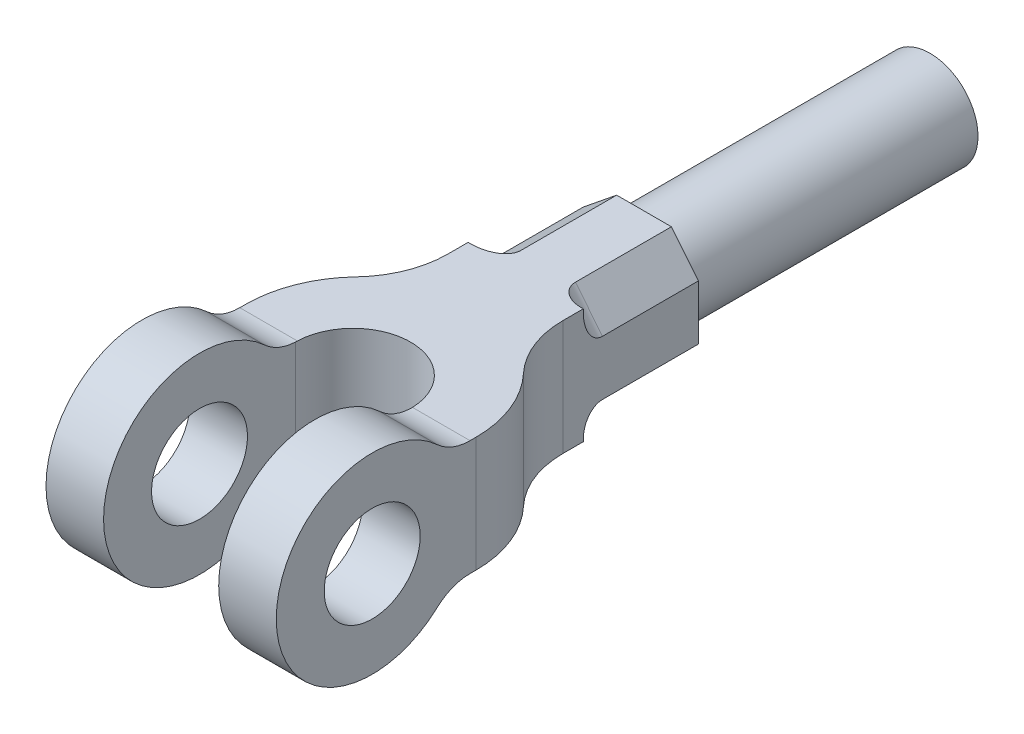
ISO-10303-21;
HEADER;
FILE_DESCRIPTION(('STEP AP214'),'2;1');
FILE_NAME('part.step','',(''),(''),'','','');
FILE_SCHEMA(('AUTOMOTIVE_DESIGN { 1 0 10303 214 1 1 1 1 }'));
ENDSEC;
DATA;
#1=APPLICATION_CONTEXT('core data for automotive mechanical design processes');
#2=APPLICATION_PROTOCOL_DEFINITION('international standard','automotive_design',2000,#1);
#3=PRODUCT_CONTEXT('',#1,'mechanical');
#4=PRODUCT('Part','Part','',(#3));
#5=PRODUCT_RELATED_PRODUCT_CATEGORY('part','',(#4));
#6=PRODUCT_DEFINITION_FORMATION('','',#4);
#7=PRODUCT_DEFINITION_CONTEXT('part definition',#1,'design');
#8=PRODUCT_DEFINITION('design','',#6,#7);
#9=PRODUCT_DEFINITION_SHAPE('','',#8);
#10=(LENGTH_UNIT() NAMED_UNIT(*) SI_UNIT(.MILLI.,.METRE.));
#11=(NAMED_UNIT(*) PLANE_ANGLE_UNIT() SI_UNIT($,.RADIAN.));
#12=(NAMED_UNIT(*) SI_UNIT($,.STERADIAN.) SOLID_ANGLE_UNIT());
#13=UNCERTAINTY_MEASURE_WITH_UNIT(LENGTH_MEASURE(1.E-05),#10,'distance_accuracy_value','');
#14=(GEOMETRIC_REPRESENTATION_CONTEXT(3) GLOBAL_UNCERTAINTY_ASSIGNED_CONTEXT((#13)) GLOBAL_UNIT_ASSIGNED_CONTEXT((#10,
#11,#12)) REPRESENTATION_CONTEXT('',''));
#15=CARTESIAN_POINT('',(0.,0.,0.));
#16=DIRECTION('',(0.,0.,1.));
#17=DIRECTION('',(1.,0.,0.));
#18=AXIS2_PLACEMENT_3D('',#15,#16,#17);
#19=CARTESIAN_POINT('',(-600.,1000.,-1250.));
#20=DIRECTION('',(0.,0.,1.));
#21=DIRECTION('',(1.,0.,0.));
#22=AXIS2_PLACEMENT_3D('',#19,#20,#21);
#23=PLANE('',#22);
#24=CARTESIAN_POINT('',(-4.44089209850063E-12,499.999999999998,-1250.));
#25=DIRECTION('',(0.,0.,1.));
#26=DIRECTION('',(1.,0.,0.));
#27=AXIS2_PLACEMENT_3D('',#24,#25,#26);
#28=CIRCLE('',#27,250.);
#29=CARTESIAN_POINT('',(249.999999999996,499.999999999998,-1250.));
#30=VERTEX_POINT('',#29);
#31=EDGE_CURVE('E501',#30,#30,#28,.F.);
#32=ORIENTED_EDGE('',*,*,#31,.F.);
#33=EDGE_LOOP('',(#32));
#34=FACE_BOUND('',#33,.T.);
#35=DIRECTION('',(0.77764026412455,0.628709487452114,0.));
#36=VECTOR('',#35,1.);
#37=CARTESIAN_POINT('',(-440.932577575048,545.382140607024,-1250.));
#38=LINE('',#37,#36);
#39=CARTESIAN_POINT('',(-300.,659.323834086931,-1250.));
#40=VERTEX_POINT('',#39);
#41=CARTESIAN_POINT('',(-126.,800.,-1250.));
#42=VERTEX_POINT('',#41);
#43=EDGE_CURVE('E341',#40,#42,#38,.T.);
#44=ORIENTED_EDGE('',*,*,#43,.T.);
#45=DIRECTION('',(1.,0.,0.));
#46=VECTOR('',#45,1.);
#47=CARTESIAN_POINT('',(-600.,800.,-1250.));
#48=LINE('',#47,#46);
#49=CARTESIAN_POINT('',(159.323834086921,800.,-1250.));
#50=VERTEX_POINT('',#49);
#51=EDGE_CURVE('E588',#42,#50,#48,.T.);
#52=ORIENTED_EDGE('',*,*,#51,.T.);
#53=DIRECTION('',(0.628709487452122,-0.777640264124543,0.));
#54=VECTOR('',#53,1.);
#55=CARTESIAN_POINT('',(487.474856353104,394.115481441266,-1250.));
#56=LINE('',#55,#54);
#57=CARTESIAN_POINT('',(300.,625.999999999997,-1250.));
#58=VERTEX_POINT('',#57);
#59=EDGE_CURVE('E625',#50,#58,#56,.T.);
#60=ORIENTED_EDGE('',*,*,#59,.T.);
#61=DIRECTION('',(0.,1.,0.));
#62=VECTOR('',#61,1.);
#63=CARTESIAN_POINT('',(300.,0.,-1250.));
#64=LINE('',#63,#62);
#65=CARTESIAN_POINT('',(300.,340.676165913073,-1250.));
#66=VERTEX_POINT('',#65);
#67=EDGE_CURVE('E388',#66,#58,#64,.T.);
#68=ORIENTED_EDGE('',*,*,#67,.F.);
#69=DIRECTION('',(-0.777640264124545,-0.62870948745212,0.));
#70=VECTOR('',#69,1.);
#71=CARTESIAN_POINT('',(-47.9772343048254,59.3422397806761,-1250.));
#72=LINE('',#71,#70);
#73=CARTESIAN_POINT('',(125.999999999993,200.,-1250.));
#74=VERTEX_POINT('',#73);
#75=EDGE_CURVE('E639',#66,#74,#72,.T.);
#76=ORIENTED_EDGE('',*,*,#75,.T.);
#77=DIRECTION('',(1.,0.,0.));
#78=VECTOR('',#77,1.);
#79=CARTESIAN_POINT('',(-600.,200.,-1250.));
#80=LINE('',#79,#78);
#81=CARTESIAN_POINT('',(-159.323834086935,200.,-1250.));
#82=VERTEX_POINT('',#81);
#83=EDGE_CURVE('E608',#82,#74,#80,.T.);
#84=ORIENTED_EDGE('',*,*,#83,.F.);
#85=DIRECTION('',(-0.628709487452117,0.777640264124548,0.));
#86=VECTOR('',#85,1.);
#87=CARTESIAN_POINT('',(1.43495552676098,1.16013817103738,-1250.));
#88=LINE('',#87,#86);
#89=CARTESIAN_POINT('',(-300.,374.000000000002,-1250.));
#90=VERTEX_POINT('',#89);
#91=EDGE_CURVE('E638',#82,#90,#88,.T.);
#92=ORIENTED_EDGE('',*,*,#91,.T.);
#93=DIRECTION('',(0.,1.,0.));
#94=VECTOR('',#93,1.);
#95=CARTESIAN_POINT('',(-300.,0.,-1250.));
#96=LINE('',#95,#94);
#97=EDGE_CURVE('E397',#90,#40,#96,.T.);
#98=ORIENTED_EDGE('',*,*,#97,.T.);
#99=EDGE_LOOP('',(#44,#52,#60,#68,#76,#84,#92,#98));
#100=FACE_BOUND('',#99,.T.);
#101=ADVANCED_FACE('F137',(#34,#100),#23,.F.);
#102=CARTESIAN_POINT('',(300.,0.,0.));
#103=DIRECTION('',(-1.,0.,0.));
#104=DIRECTION('',(0.,0.,1.));
#105=AXIS2_PLACEMENT_3D('',#102,#103,#104);
#106=PLANE('',#105);
#107=DIRECTION('',(0.,-1.,0.));
#108=VECTOR('',#107,1.);
#109=CARTESIAN_POINT('',(300.,0.,-650.));
#110=LINE('',#109,#108);
#111=CARTESIAN_POINT('',(300.,212.082001473069,-650.));
#112=VERTEX_POINT('',#111);
#113=CARTESIAN_POINT('',(300.,200.,-650.));
#114=VERTEX_POINT('',#113);
#115=EDGE_CURVE('E642',#112,#114,#110,.T.);
#116=ORIENTED_EDGE('',*,*,#115,.F.);
#117=CARTESIAN_POINT('',(300.,212.082001473069,-750.));
#118=DIRECTION('',(-1.,0.,0.));
#119=DIRECTION('',(0.,1.,0.));
#120=AXIS2_PLACEMENT_3D('',#117,#118,#119);
#121=ELLIPSE('',#120,128.594164440004,100.);
#122=CARTESIAN_POINT('',(300.,340.676165913073,-750.));
#123=VERTEX_POINT('',#122);
#124=EDGE_CURVE('E699',#112,#123,#121,.T.);
#125=ORIENTED_EDGE('',*,*,#124,.T.);
#126=DIRECTION('',(0.,0.,-1.));
#127=VECTOR('',#126,1.);
#128=CARTESIAN_POINT('',(300.,340.676165913073,-650.));
#129=LINE('',#128,#127);
#130=EDGE_CURVE('E633',#123,#66,#129,.T.);
#131=ORIENTED_EDGE('',*,*,#130,.T.);
#132=ORIENTED_EDGE('',*,*,#67,.T.);
#133=DIRECTION('',(0.,0.,-1.));
#134=VECTOR('',#133,1.);
#135=CARTESIAN_POINT('',(300.,625.999999999997,-650.));
#136=LINE('',#135,#134);
#137=CARTESIAN_POINT('',(300.,625.999999999997,-750.));
#138=VERTEX_POINT('',#137);
#139=EDGE_CURVE('E618',#138,#58,#136,.T.);
#140=ORIENTED_EDGE('',*,*,#139,.F.);
#141=CARTESIAN_POINT('',(300.,785.05597417537,-750.));
#142=DIRECTION('',(-1.,0.,0.));
#143=DIRECTION('',(0.,1.,0.));
#144=AXIS2_PLACEMENT_3D('',#141,#142,#143);
#145=ELLIPSE('',#144,159.055974175378,100.);
#146=CARTESIAN_POINT('',(300.,785.055974175371,-650.));
#147=VERTEX_POINT('',#146);
#148=EDGE_CURVE('E693',#138,#147,#145,.T.);
#149=ORIENTED_EDGE('',*,*,#148,.T.);
#150=DIRECTION('',(0.,-1.,0.));
#151=VECTOR('',#150,1.);
#152=CARTESIAN_POINT('',(300.,0.,-650.));
#153=LINE('',#152,#151);
#154=CARTESIAN_POINT('',(300.,800.,-650.));
#155=VERTEX_POINT('',#154);
#156=EDGE_CURVE('E623',#155,#147,#153,.T.);
#157=ORIENTED_EDGE('',*,*,#156,.F.);
#158=DIRECTION('',(0.,0.,-1.));
#159=VECTOR('',#158,1.);
#160=CARTESIAN_POINT('',(300.,800.,-1.58264725967266E-13));
#161=LINE('',#160,#159);
#162=CARTESIAN_POINT('',(300.,800.,-544.983443527075));
#163=VERTEX_POINT('',#162);
#164=EDGE_CURVE('E403',#163,#155,#161,.T.);
#165=ORIENTED_EDGE('',*,*,#164,.F.);
#166=DIRECTION('',(0.,1.,0.));
#167=VECTOR('',#166,1.);
#168=CARTESIAN_POINT('',(300.,0.,-544.983443527075));
#169=LINE('',#168,#167);
#170=CARTESIAN_POINT('',(300.,200.,-544.983443527075));
#171=VERTEX_POINT('',#170);
#172=EDGE_CURVE('E386',#171,#163,#169,.T.);
#173=ORIENTED_EDGE('',*,*,#172,.F.);
#174=DIRECTION('',(0.,0.,-1.));
#175=VECTOR('',#174,1.);
#176=CARTESIAN_POINT('',(300.,200.,0.));
#177=LINE('',#176,#175);
#178=EDGE_CURVE('E406',#171,#114,#177,.T.);
#179=ORIENTED_EDGE('',*,*,#178,.T.);
#180=EDGE_LOOP('',(#116,#125,#131,#132,#140,#149,#157,#165,#173,#179));
#181=FACE_BOUND('',#180,.T.);
#182=ADVANCED_FACE('F526',(#181),#106,.F.);
#183=CARTESIAN_POINT('',(-600.,800.,0.));
#184=DIRECTION('',(0.,1.,0.));
#185=DIRECTION('',(0.,0.,1.));
#186=AXIS2_PLACEMENT_3D('',#183,#184,#185);
#187=PLANE('',#186);
#188=ORIENTED_EDGE('',*,*,#51,.F.);
#189=DIRECTION('',(0.,0.,-1.));
#190=VECTOR('',#189,1.);
#191=CARTESIAN_POINT('',(-126.,800.,-650.));
#192=LINE('',#191,#190);
#193=CARTESIAN_POINT('',(-126.,800.,-750.));
#194=VERTEX_POINT('',#193);
#195=EDGE_CURVE('E352',#194,#42,#192,.T.);
#196=ORIENTED_EDGE('',*,*,#195,.F.);
#197=CARTESIAN_POINT('',(-285.05597417538,800.,-750.));
#198=DIRECTION('',(0.,1.,0.));
#199=DIRECTION('',(-1.,0.,0.));
#200=AXIS2_PLACEMENT_3D('',#197,#198,#199);
#201=ELLIPSE('',#200,159.05597417538,100.);
#202=CARTESIAN_POINT('',(-285.05597417538,800.,-650.));
#203=VERTEX_POINT('',#202);
#204=EDGE_CURVE('E351',#194,#203,#201,.F.);
#205=ORIENTED_EDGE('',*,*,#204,.T.);
#206=DIRECTION('',(1.,0.,0.));
#207=VECTOR('',#206,1.);
#208=CARTESIAN_POINT('',(0.,800.,-650.));
#209=LINE('',#208,#207);
#210=CARTESIAN_POINT('',(-300.,800.,-650.));
#211=VERTEX_POINT('',#210);
#212=EDGE_CURVE('E336',#211,#203,#209,.T.);
#213=ORIENTED_EDGE('',*,*,#212,.F.);
#214=DIRECTION('',(0.,0.,-1.));
#215=VECTOR('',#214,1.);
#216=CARTESIAN_POINT('',(-300.,800.,0.));
#217=LINE('',#216,#215);
#218=CARTESIAN_POINT('',(-300.,800.,-544.983443527075));
#219=VERTEX_POINT('',#218);
#220=EDGE_CURVE('E348',#219,#211,#217,.T.);
#221=ORIENTED_EDGE('',*,*,#220,.F.);
#222=CARTESIAN_POINT('',(-800.,800.,-544.983443527075));
#223=DIRECTION('',(0.,1.,0.));
#224=DIRECTION('',(0.,0.,1.));
#225=AXIS2_PLACEMENT_3D('',#222,#223,#224);
#226=CIRCLE('',#225,500.);
#227=CARTESIAN_POINT('',(-436.363636363636,800.,-201.809151014769));
#228=VERTEX_POINT('',#227);
#229=EDGE_CURVE('E358',#228,#219,#226,.T.);
#230=ORIENTED_EDGE('',*,*,#229,.F.);
#231=CARTESIAN_POINT('',(0.,800.,210.));
#232=DIRECTION('',(0.,1.,0.));
#233=DIRECTION('',(0.,0.,1.));
#234=AXIS2_PLACEMENT_3D('',#231,#232,#233);
#235=CIRCLE('',#234,600.);
#236=CARTESIAN_POINT('',(-600.,800.,210.));
#237=VERTEX_POINT('',#236);
#238=EDGE_CURVE('E361',#237,#228,#235,.F.);
#239=ORIENTED_EDGE('',*,*,#238,.F.);
#240=DIRECTION('',(0.,0.,1.));
#241=VECTOR('',#240,1.);
#242=CARTESIAN_POINT('',(-600.,800.,0.));
#243=LINE('',#242,#241);
#244=CARTESIAN_POINT('',(-600.,800.,240.098048640722));
#245=VERTEX_POINT('',#244);
#246=EDGE_CURVE('E583',#237,#245,#243,.T.);
#247=ORIENTED_EDGE('',*,*,#246,.T.);
#248=DIRECTION('',(-1.,0.,0.));
#249=VECTOR('',#248,1.);
#250=CARTESIAN_POINT('',(-300.,800.,240.098048640722));
#251=LINE('',#250,#249);
#252=CARTESIAN_POINT('',(-299.836541067426,800.,240.098048640722));
#253=VERTEX_POINT('',#252);
#254=EDGE_CURVE('E431',#245,#253,#251,.F.);
#255=ORIENTED_EDGE('',*,*,#254,.T.);
#256=CARTESIAN_POINT('',(0.,800.,250.));
#257=DIRECTION('',(0.,1.,0.));
#258=DIRECTION('',(0.,0.,1.));
#259=AXIS2_PLACEMENT_3D('',#256,#257,#258);
#260=CIRCLE('',#259,300.);
#261=CARTESIAN_POINT('',(299.836541067426,800.,240.098048640722));
#262=VERTEX_POINT('',#261);
#263=EDGE_CURVE('E359',#253,#262,#260,.F.);
#264=ORIENTED_EDGE('',*,*,#263,.T.);
#265=DIRECTION('',(-1.,0.,0.));
#266=VECTOR('',#265,1.);
#267=CARTESIAN_POINT('',(600.,800.,240.098048640722));
#268=LINE('',#267,#266);
#269=CARTESIAN_POINT('',(600.,800.,240.098048640722));
#270=VERTEX_POINT('',#269);
#271=EDGE_CURVE('E428',#262,#270,#268,.F.);
#272=ORIENTED_EDGE('',*,*,#271,.T.);
#273=DIRECTION('',(0.,0.,1.));
#274=VECTOR('',#273,1.);
#275=CARTESIAN_POINT('',(600.,800.,-1.74630847277233E-13));
#276=LINE('',#275,#274);
#277=CARTESIAN_POINT('',(600.,800.,210.));
#278=VERTEX_POINT('',#277);
#279=EDGE_CURVE('E582',#278,#270,#276,.T.);
#280=ORIENTED_EDGE('',*,*,#279,.F.);
#281=CARTESIAN_POINT('',(0.,800.,210.));
#282=DIRECTION('',(0.,1.,0.));
#283=DIRECTION('',(0.,0.,1.));
#284=AXIS2_PLACEMENT_3D('',#281,#282,#283);
#285=CIRCLE('',#284,600.);
#286=CARTESIAN_POINT('',(436.363636363636,800.,-201.809151014768));
#287=VERTEX_POINT('',#286);
#288=EDGE_CURVE('E364',#287,#278,#285,.F.);
#289=ORIENTED_EDGE('',*,*,#288,.F.);
#290=CARTESIAN_POINT('',(800.,800.,-544.983443527075));
#291=DIRECTION('',(0.,1.,0.));
#292=DIRECTION('',(0.,0.,1.));
#293=AXIS2_PLACEMENT_3D('',#290,#291,#292);
#294=CIRCLE('',#293,500.);
#295=EDGE_CURVE('E573',#287,#163,#294,.F.);
#296=ORIENTED_EDGE('',*,*,#295,.T.);
#297=ORIENTED_EDGE('',*,*,#164,.T.);
#298=DIRECTION('',(1.,0.,0.));
#299=VECTOR('',#298,1.);
#300=CARTESIAN_POINT('',(0.,800.,-650.));
#301=LINE('',#300,#299);
#302=CARTESIAN_POINT('',(287.917998526926,800.,-650.));
#303=VERTEX_POINT('',#302);
#304=EDGE_CURVE('E628',#303,#155,#301,.T.);
#305=ORIENTED_EDGE('',*,*,#304,.F.);
#306=CARTESIAN_POINT('',(287.917998526926,800.,-750.));
#307=DIRECTION('',(0.,1.,0.));
#308=DIRECTION('',(-1.,0.,0.));
#309=AXIS2_PLACEMENT_3D('',#306,#307,#308);
#310=ELLIPSE('',#309,128.594164440004,100.);
#311=CARTESIAN_POINT('',(159.323834086921,800.,-750.));
#312=VERTEX_POINT('',#311);
#313=EDGE_CURVE('E695',#303,#312,#310,.F.);
#314=ORIENTED_EDGE('',*,*,#313,.T.);
#315=DIRECTION('',(0.,0.,-1.));
#316=VECTOR('',#315,1.);
#317=CARTESIAN_POINT('',(159.323834086921,800.,-650.));
#318=LINE('',#317,#316);
#319=EDGE_CURVE('E621',#312,#50,#318,.T.);
#320=ORIENTED_EDGE('',*,*,#319,.T.);
#321=EDGE_LOOP('',(#188,#196,#205,#213,#221,#230,#239,#247,#255,#264,#272,#280,#289,#296,#297,
#305,#314,#320));
#322=FACE_BOUND('',#321,.T.);
#323=ADVANCED_FACE('F346',(#322),#187,.T.);
#324=CARTESIAN_POINT('',(-300.,0.,0.));
#325=DIRECTION('',(-1.,0.,0.));
#326=DIRECTION('',(0.,0.,1.));
#327=AXIS2_PLACEMENT_3D('',#324,#325,#326);
#328=PLANE('',#327);
#329=DIRECTION('',(0.,1.,0.));
#330=VECTOR('',#329,1.);
#331=CARTESIAN_POINT('',(-300.,0.,-650.));
#332=LINE('',#331,#330);
#333=CARTESIAN_POINT('',(-300.,787.917998526934,-650.));
#334=VERTEX_POINT('',#333);
#335=EDGE_CURVE('E333',#334,#211,#332,.T.);
#336=ORIENTED_EDGE('',*,*,#335,.F.);
#337=CARTESIAN_POINT('',(-300.,787.917998526934,-750.));
#338=DIRECTION('',(-1.,0.,0.));
#339=DIRECTION('',(0.,-1.,0.));
#340=AXIS2_PLACEMENT_3D('',#337,#338,#339);
#341=ELLIPSE('',#340,128.594164440003,100.);
#342=CARTESIAN_POINT('',(-300.,659.323834086931,-750.));
#343=VERTEX_POINT('',#342);
#344=EDGE_CURVE('E677',#334,#343,#341,.F.);
#345=ORIENTED_EDGE('',*,*,#344,.T.);
#346=DIRECTION('',(0.,0.,-1.));
#347=VECTOR('',#346,1.);
#348=CARTESIAN_POINT('',(-300.,659.323834086931,-650.));
#349=LINE('',#348,#347);
#350=EDGE_CURVE('E629',#343,#40,#349,.T.);
#351=ORIENTED_EDGE('',*,*,#350,.T.);
#352=ORIENTED_EDGE('',*,*,#97,.F.);
#353=DIRECTION('',(0.,0.,-1.));
#354=VECTOR('',#353,1.);
#355=CARTESIAN_POINT('',(-300.,374.000000000002,-650.));
#356=LINE('',#355,#354);
#357=CARTESIAN_POINT('',(-300.,374.000000000002,-750.));
#358=VERTEX_POINT('',#357);
#359=EDGE_CURVE('E649',#358,#90,#356,.T.);
#360=ORIENTED_EDGE('',*,*,#359,.F.);
#361=CARTESIAN_POINT('',(-300.,214.944025824615,-750.));
#362=DIRECTION('',(-1.,0.,0.));
#363=DIRECTION('',(0.,-1.,0.));
#364=AXIS2_PLACEMENT_3D('',#361,#362,#363);
#365=ELLIPSE('',#364,159.055974175379,100.);
#366=CARTESIAN_POINT('',(-300.,214.944025824615,-650.));
#367=VERTEX_POINT('',#366);
#368=EDGE_CURVE('E145',#358,#367,#365,.F.);
#369=ORIENTED_EDGE('',*,*,#368,.T.);
#370=DIRECTION('',(0.,1.,0.));
#371=VECTOR('',#370,1.);
#372=CARTESIAN_POINT('',(-300.,0.,-650.));
#373=LINE('',#372,#371);
#374=CARTESIAN_POINT('',(-300.,200.,-650.));
#375=VERTEX_POINT('',#374);
#376=EDGE_CURVE('E650',#375,#367,#373,.T.);
#377=ORIENTED_EDGE('',*,*,#376,.F.);
#378=DIRECTION('',(0.,0.,-1.));
#379=VECTOR('',#378,1.);
#380=CARTESIAN_POINT('',(-300.,200.,0.));
#381=LINE('',#380,#379);
#382=CARTESIAN_POINT('',(-300.,200.,-544.983443527075));
#383=VERTEX_POINT('',#382);
#384=EDGE_CURVE('E596',#383,#375,#381,.T.);
#385=ORIENTED_EDGE('',*,*,#384,.F.);
#386=DIRECTION('',(0.,1.,0.));
#387=VECTOR('',#386,1.);
#388=CARTESIAN_POINT('',(-300.,0.,-544.983443527075));
#389=LINE('',#388,#387);
#390=EDGE_CURVE('E357',#383,#219,#389,.T.);
#391=ORIENTED_EDGE('',*,*,#390,.T.);
#392=ORIENTED_EDGE('',*,*,#220,.T.);
#393=EDGE_LOOP('',(#336,#345,#351,#352,#360,#369,#377,#385,#391,#392));
#394=FACE_BOUND('',#393,.T.);
#395=ADVANCED_FACE('F354',(#394),#328,.T.);
#396=CARTESIAN_POINT('',(-600.,200.,0.));
#397=DIRECTION('',(0.,1.,0.));
#398=DIRECTION('',(0.,0.,1.));
#399=AXIS2_PLACEMENT_3D('',#396,#397,#398);
#400=PLANE('',#399);
#401=DIRECTION('',(-1.,0.,0.));
#402=VECTOR('',#401,1.);
#403=CARTESIAN_POINT('',(0.,200.,-650.));
#404=LINE('',#403,#402);
#405=CARTESIAN_POINT('',(-287.917998526938,200.,-650.));
#406=VERTEX_POINT('',#405);
#407=EDGE_CURVE('E654',#406,#375,#404,.T.);
#408=ORIENTED_EDGE('',*,*,#407,.F.);
#409=CARTESIAN_POINT('',(-287.917998526938,200.,-750.));
#410=DIRECTION('',(0.,1.,0.));
#411=DIRECTION('',(1.,0.,0.));
#412=AXIS2_PLACEMENT_3D('',#409,#410,#411);
#413=ELLIPSE('',#412,128.594164440004,100.);
#414=CARTESIAN_POINT('',(-159.323834086935,200.,-750.));
#415=VERTEX_POINT('',#414);
#416=EDGE_CURVE('E12',#406,#415,#413,.T.);
#417=ORIENTED_EDGE('',*,*,#416,.T.);
#418=DIRECTION('',(0.,0.,-1.));
#419=VECTOR('',#418,1.);
#420=CARTESIAN_POINT('',(-159.323834086935,200.,-650.));
#421=LINE('',#420,#419);
#422=EDGE_CURVE('E647',#415,#82,#421,.T.);
#423=ORIENTED_EDGE('',*,*,#422,.T.);
#424=ORIENTED_EDGE('',*,*,#83,.T.);
#425=DIRECTION('',(0.,0.,-1.));
#426=VECTOR('',#425,1.);
#427=CARTESIAN_POINT('',(125.999999999993,200.,-650.));
#428=LINE('',#427,#426);
#429=CARTESIAN_POINT('',(125.999999999993,200.,-750.));
#430=VERTEX_POINT('',#429);
#431=EDGE_CURVE('E635',#430,#74,#428,.T.);
#432=ORIENTED_EDGE('',*,*,#431,.F.);
#433=CARTESIAN_POINT('',(285.055974175375,200.,-750.));
#434=DIRECTION('',(0.,1.,0.));
#435=DIRECTION('',(1.,0.,0.));
#436=AXIS2_PLACEMENT_3D('',#433,#434,#435);
#437=ELLIPSE('',#436,159.055974175379,100.);
#438=CARTESIAN_POINT('',(285.055974175376,200.,-650.));
#439=VERTEX_POINT('',#438);
#440=EDGE_CURVE('E697',#430,#439,#437,.T.);
#441=ORIENTED_EDGE('',*,*,#440,.T.);
#442=DIRECTION('',(-1.,0.,0.));
#443=VECTOR('',#442,1.);
#444=CARTESIAN_POINT('',(0.,200.,-650.));
#445=LINE('',#444,#443);
#446=EDGE_CURVE('E636',#114,#439,#445,.T.);
#447=ORIENTED_EDGE('',*,*,#446,.F.);
#448=ORIENTED_EDGE('',*,*,#178,.F.);
#449=CARTESIAN_POINT('',(800.,200.,-544.983443527075));
#450=DIRECTION('',(0.,1.,0.));
#451=DIRECTION('',(0.,0.,1.));
#452=AXIS2_PLACEMENT_3D('',#449,#450,#451);
#453=CIRCLE('',#452,500.);
#454=CARTESIAN_POINT('',(436.363636363636,200.,-201.809151014768));
#455=VERTEX_POINT('',#454);
#456=EDGE_CURVE('E570',#455,#171,#453,.F.);
#457=ORIENTED_EDGE('',*,*,#456,.F.);
#458=CARTESIAN_POINT('',(0.,200.,210.));
#459=DIRECTION('',(0.,1.,0.));
#460=DIRECTION('',(0.,0.,1.));
#461=AXIS2_PLACEMENT_3D('',#458,#459,#460);
#462=CIRCLE('',#461,600.);
#463=CARTESIAN_POINT('',(600.,200.,210.));
#464=VERTEX_POINT('',#463);
#465=EDGE_CURVE('E578',#455,#464,#462,.F.);
#466=ORIENTED_EDGE('',*,*,#465,.T.);
#467=DIRECTION('',(0.,0.,1.));
#468=VECTOR('',#467,1.);
#469=CARTESIAN_POINT('',(600.,200.,0.));
#470=LINE('',#469,#468);
#471=CARTESIAN_POINT('',(600.,200.,240.098048640722));
#472=VERTEX_POINT('',#471);
#473=EDGE_CURVE('E604',#464,#472,#470,.T.);
#474=ORIENTED_EDGE('',*,*,#473,.T.);
#475=DIRECTION('',(1.,0.,0.));
#476=VECTOR('',#475,1.);
#477=CARTESIAN_POINT('',(-600.,200.,240.098048640722));
#478=LINE('',#477,#476);
#479=CARTESIAN_POINT('',(299.836541067426,200.,240.098048640722));
#480=VERTEX_POINT('',#479);
#481=EDGE_CURVE('E419',#472,#480,#478,.F.);
#482=ORIENTED_EDGE('',*,*,#481,.T.);
#483=CARTESIAN_POINT('',(0.,200.,250.));
#484=DIRECTION('',(0.,1.,0.));
#485=DIRECTION('',(0.,0.,1.));
#486=AXIS2_PLACEMENT_3D('',#483,#484,#485);
#487=CIRCLE('',#486,300.);
#488=CARTESIAN_POINT('',(-299.836541067426,200.,240.098048640722));
#489=VERTEX_POINT('',#488);
#490=EDGE_CURVE('E599',#489,#480,#487,.F.);
#491=ORIENTED_EDGE('',*,*,#490,.F.);
#492=DIRECTION('',(1.,0.,0.));
#493=VECTOR('',#492,1.);
#494=CARTESIAN_POINT('',(-600.,200.,240.098048640722));
#495=LINE('',#494,#493);
#496=CARTESIAN_POINT('',(-600.,200.,240.098048640722));
#497=VERTEX_POINT('',#496);
#498=EDGE_CURVE('E421',#489,#497,#495,.F.);
#499=ORIENTED_EDGE('',*,*,#498,.T.);
#500=DIRECTION('',(0.,0.,1.));
#501=VECTOR('',#500,1.);
#502=CARTESIAN_POINT('',(-600.,200.,0.));
#503=LINE('',#502,#501);
#504=CARTESIAN_POINT('',(-600.,200.,210.));
#505=VERTEX_POINT('',#504);
#506=EDGE_CURVE('E605',#505,#497,#503,.T.);
#507=ORIENTED_EDGE('',*,*,#506,.F.);
#508=CARTESIAN_POINT('',(0.,200.,210.));
#509=DIRECTION('',(0.,1.,0.));
#510=DIRECTION('',(0.,0.,1.));
#511=AXIS2_PLACEMENT_3D('',#508,#509,#510);
#512=CIRCLE('',#511,600.);
#513=CARTESIAN_POINT('',(-436.363636363636,200.,-201.809151014769));
#514=VERTEX_POINT('',#513);
#515=EDGE_CURVE('E590',#505,#514,#512,.F.);
#516=ORIENTED_EDGE('',*,*,#515,.T.);
#517=CARTESIAN_POINT('',(-800.,200.,-544.983443527075));
#518=DIRECTION('',(0.,1.,0.));
#519=DIRECTION('',(0.,0.,1.));
#520=AXIS2_PLACEMENT_3D('',#517,#518,#519);
#521=CIRCLE('',#520,500.);
#522=EDGE_CURVE('E594',#514,#383,#521,.T.);
#523=ORIENTED_EDGE('',*,*,#522,.T.);
#524=ORIENTED_EDGE('',*,*,#384,.T.);
#525=EDGE_LOOP('',(#408,#417,#423,#424,#432,#441,#447,#448,#457,#466,#474,#482,#491,#499,#507,
#516,#523,#524));
#526=FACE_BOUND('',#525,.T.);
#527=ADVANCED_FACE('F540',(#526),#400,.F.);
#528=CARTESIAN_POINT('',(-600.,1000.,-1250.));
#529=DIRECTION('',(1.,0.,0.));
#530=DIRECTION('',(0.,0.,-1.));
#531=AXIS2_PLACEMENT_3D('',#528,#529,#530);
#532=PLANE('',#531);
#533=CARTESIAN_POINT('',(-600.,500.,750.));
#534=DIRECTION('',(1.,0.,0.));
#535=DIRECTION('',(0.,0.,-1.));
#536=AXIS2_PLACEMENT_3D('',#533,#534,#535);
#537=CIRCLE('',#536,250.);
#538=CARTESIAN_POINT('',(-600.,500.,500.));
#539=VERTEX_POINT('',#538);
#540=EDGE_CURVE('E615',#539,#539,#537,.T.);
#541=ORIENTED_EDGE('',*,*,#540,.T.);
#542=EDGE_LOOP('',(#541));
#543=FACE_BOUND('',#542,.T.);
#544=ORIENTED_EDGE('',*,*,#506,.T.);
#545=CARTESIAN_POINT('',(-600.,-50.,240.098048640722));
#546=DIRECTION('',(1.,0.,0.));
#547=DIRECTION('',(0.,0.,-1.));
#548=AXIS2_PLACEMENT_3D('',#545,#546,#547);
#549=CIRCLE('',#548,250.);
#550=CARTESIAN_POINT('',(-600.,133.333333333333,410.065365760481));
#551=VERTEX_POINT('',#550);
#552=EDGE_CURVE('E445',#497,#551,#549,.T.);
#553=ORIENTED_EDGE('',*,*,#552,.T.);
#554=CARTESIAN_POINT('',(-600.,500.,750.));
#555=DIRECTION('',(1.,0.,0.));
#556=DIRECTION('',(0.,0.,-1.));
#557=AXIS2_PLACEMENT_3D('',#554,#555,#556);
#558=CIRCLE('',#557,500.);
#559=CARTESIAN_POINT('',(-600.,866.666666666667,410.065365760481));
#560=VERTEX_POINT('',#559);
#561=EDGE_CURVE('E371',#560,#551,#558,.T.);
#562=ORIENTED_EDGE('',*,*,#561,.F.);
#563=CARTESIAN_POINT('',(-600.,1050.,240.098048640722));
#564=DIRECTION('',(1.,0.,0.));
#565=DIRECTION('',(0.,0.,-1.));
#566=AXIS2_PLACEMENT_3D('',#563,#564,#565);
#567=CIRCLE('',#566,250.);
#568=EDGE_CURVE('E488',#560,#245,#567,.T.);
#569=ORIENTED_EDGE('',*,*,#568,.T.);
#570=ORIENTED_EDGE('',*,*,#246,.F.);
#571=DIRECTION('',(0.,1.,0.));
#572=VECTOR('',#571,1.);
#573=CARTESIAN_POINT('',(-600.,0.,210.));
#574=LINE('',#573,#572);
#575=EDGE_CURVE('E395',#505,#237,#574,.T.);
#576=ORIENTED_EDGE('',*,*,#575,.F.);
#577=EDGE_LOOP('',(#544,#553,#562,#569,#570,#576));
#578=FACE_BOUND('',#577,.T.);
#579=ADVANCED_FACE('F537',(#543,#578),#532,.F.);
#580=CARTESIAN_POINT('',(600.,1000.,-1250.));
#581=DIRECTION('',(-1.,0.,0.));
#582=DIRECTION('',(0.,0.,1.));
#583=AXIS2_PLACEMENT_3D('',#580,#581,#582);
#584=PLANE('',#583);
#585=CARTESIAN_POINT('',(600.,500.,750.));
#586=DIRECTION('',(1.,0.,0.));
#587=DIRECTION('',(0.,0.,-1.));
#588=AXIS2_PLACEMENT_3D('',#585,#586,#587);
#589=CIRCLE('',#588,250.);
#590=CARTESIAN_POINT('',(600.,500.,500.));
#591=VERTEX_POINT('',#590);
#592=EDGE_CURVE('E414',#591,#591,#589,.T.);
#593=ORIENTED_EDGE('',*,*,#592,.F.);
#594=EDGE_LOOP('',(#593));
#595=FACE_BOUND('',#594,.T.);
#596=ORIENTED_EDGE('',*,*,#279,.T.);
#597=CARTESIAN_POINT('',(600.,1050.,240.098048640722));
#598=DIRECTION('',(-1.,0.,0.));
#599=DIRECTION('',(0.,0.,1.));
#600=AXIS2_PLACEMENT_3D('',#597,#598,#599);
#601=CIRCLE('',#600,250.);
#602=CARTESIAN_POINT('',(600.,866.666666666667,410.065365760481));
#603=VERTEX_POINT('',#602);
#604=EDGE_CURVE('E490',#270,#603,#601,.T.);
#605=ORIENTED_EDGE('',*,*,#604,.T.);
#606=CARTESIAN_POINT('',(600.,500.,750.));
#607=DIRECTION('',(1.,0.,0.));
#608=DIRECTION('',(0.,0.,-1.));
#609=AXIS2_PLACEMENT_3D('',#606,#607,#608);
#610=CIRCLE('',#609,500.);
#611=CARTESIAN_POINT('',(600.,133.333333333333,410.065365760481));
#612=VERTEX_POINT('',#611);
#613=EDGE_CURVE('E370',#603,#612,#610,.T.);
#614=ORIENTED_EDGE('',*,*,#613,.T.);
#615=CARTESIAN_POINT('',(600.,-50.,240.098048640722));
#616=DIRECTION('',(-1.,0.,0.));
#617=DIRECTION('',(0.,0.,1.));
#618=AXIS2_PLACEMENT_3D('',#615,#616,#617);
#619=CIRCLE('',#618,250.);
#620=EDGE_CURVE('E477',#612,#472,#619,.T.);
#621=ORIENTED_EDGE('',*,*,#620,.T.);
#622=ORIENTED_EDGE('',*,*,#473,.F.);
#623=DIRECTION('',(0.,1.,0.));
#624=VECTOR('',#623,1.);
#625=CARTESIAN_POINT('',(600.,0.,210.));
#626=LINE('',#625,#624);
#627=EDGE_CURVE('E382',#464,#278,#626,.T.);
#628=ORIENTED_EDGE('',*,*,#627,.T.);
#629=EDGE_LOOP('',(#596,#605,#614,#621,#622,#628));
#630=FACE_BOUND('',#629,.T.);
#631=ADVANCED_FACE('F459',(#595,#630),#584,.F.);
#632=CARTESIAN_POINT('',(300.,0.,0.));
#633=DIRECTION('',(-1.,0.,0.));
#634=DIRECTION('',(0.,0.,1.));
#635=AXIS2_PLACEMENT_3D('',#632,#633,#634);
#636=PLANE('',#635);
#637=CARTESIAN_POINT('',(300.,500.,750.));
#638=DIRECTION('',(-1.,0.,0.));
#639=DIRECTION('',(0.,0.,1.));
#640=AXIS2_PLACEMENT_3D('',#637,#638,#639);
#641=CIRCLE('',#640,250.);
#642=CARTESIAN_POINT('',(300.,500.,1000.));
#643=VERTEX_POINT('',#642);
#644=EDGE_CURVE('E413',#643,#643,#641,.T.);
#645=ORIENTED_EDGE('',*,*,#644,.F.);
#646=EDGE_LOOP('',(#645));
#647=FACE_BOUND('',#646,.T.);
#648=DIRECTION('',(0.,1.,0.));
#649=VECTOR('',#648,1.);
#650=CARTESIAN_POINT('',(300.,0.,250.));
#651=LINE('',#650,#649);
#652=CARTESIAN_POINT('',(300.,199.803825749884,250.));
#653=VERTEX_POINT('',#652);
#654=CARTESIAN_POINT('',(300.,800.196174250116,250.));
#655=VERTEX_POINT('',#654);
#656=EDGE_CURVE('E380',#653,#655,#651,.T.);
#657=ORIENTED_EDGE('',*,*,#656,.F.);
#658=CARTESIAN_POINT('',(300.,-50.,240.098048640722));
#659=DIRECTION('',(-1.,0.,0.));
#660=DIRECTION('',(0.,0.,1.));
#661=AXIS2_PLACEMENT_3D('',#658,#659,#660);
#662=CIRCLE('',#661,250.);
#663=CARTESIAN_POINT('',(300.,133.333333333333,410.065365760481));
#664=VERTEX_POINT('',#663);
#665=EDGE_CURVE('E476',#653,#664,#662,.F.);
#666=ORIENTED_EDGE('',*,*,#665,.T.);
#667=CARTESIAN_POINT('',(300.,500.,750.));
#668=DIRECTION('',(-1.,0.,0.));
#669=DIRECTION('',(0.,0.,1.));
#670=AXIS2_PLACEMENT_3D('',#667,#668,#669);
#671=CIRCLE('',#670,500.);
#672=CARTESIAN_POINT('',(300.,866.666666666667,410.065365760481));
#673=VERTEX_POINT('',#672);
#674=EDGE_CURVE('E374',#664,#673,#671,.T.);
#675=ORIENTED_EDGE('',*,*,#674,.T.);
#676=CARTESIAN_POINT('',(300.,1050.,240.098048640722));
#677=DIRECTION('',(-1.,0.,0.));
#678=DIRECTION('',(0.,0.,1.));
#679=AXIS2_PLACEMENT_3D('',#676,#677,#678);
#680=CIRCLE('',#679,250.);
#681=EDGE_CURVE('E492',#673,#655,#680,.F.);
#682=ORIENTED_EDGE('',*,*,#681,.T.);
#683=EDGE_LOOP('',(#657,#666,#675,#682));
#684=FACE_BOUND('',#683,.T.);
#685=ADVANCED_FACE('F743',(#647,#684),#636,.T.);
#686=CARTESIAN_POINT('',(-300.,0.,0.));
#687=DIRECTION('',(-1.,0.,0.));
#688=DIRECTION('',(0.,0.,1.));
#689=AXIS2_PLACEMENT_3D('',#686,#687,#688);
#690=PLANE('',#689);
#691=CARTESIAN_POINT('',(-300.,500.,750.));
#692=DIRECTION('',(-1.,0.,0.));
#693=DIRECTION('',(0.,0.,1.));
#694=AXIS2_PLACEMENT_3D('',#691,#692,#693);
#695=CIRCLE('',#694,250.);
#696=CARTESIAN_POINT('',(-300.,500.,1000.));
#697=VERTEX_POINT('',#696);
#698=EDGE_CURVE('E410',#697,#697,#695,.T.);
#699=ORIENTED_EDGE('',*,*,#698,.T.);
#700=EDGE_LOOP('',(#699));
#701=FACE_BOUND('',#700,.T.);
#702=CARTESIAN_POINT('',(-300.,500.,750.));
#703=DIRECTION('',(-1.,0.,0.));
#704=DIRECTION('',(0.,0.,1.));
#705=AXIS2_PLACEMENT_3D('',#702,#703,#704);
#706=CIRCLE('',#705,500.);
#707=CARTESIAN_POINT('',(-300.,133.333333333333,410.065365760481));
#708=VERTEX_POINT('',#707);
#709=CARTESIAN_POINT('',(-300.,866.666666666667,410.065365760481));
#710=VERTEX_POINT('',#709);
#711=EDGE_CURVE('E394',#708,#710,#706,.T.);
#712=ORIENTED_EDGE('',*,*,#711,.F.);
#713=CARTESIAN_POINT('',(-300.,-50.,240.098048640722));
#714=DIRECTION('',(-1.,0.,0.));
#715=DIRECTION('',(0.,0.,1.));
#716=AXIS2_PLACEMENT_3D('',#713,#714,#715);
#717=CIRCLE('',#716,250.);
#718=CARTESIAN_POINT('',(-300.,199.803825749884,250.));
#719=VERTEX_POINT('',#718);
#720=EDGE_CURVE('E434',#708,#719,#717,.T.);
#721=ORIENTED_EDGE('',*,*,#720,.T.);
#722=DIRECTION('',(0.,1.,0.));
#723=VECTOR('',#722,1.);
#724=CARTESIAN_POINT('',(-300.,0.,250.));
#725=LINE('',#724,#723);
#726=CARTESIAN_POINT('',(-300.,800.196174250116,250.));
#727=VERTEX_POINT('',#726);
#728=EDGE_CURVE('E379',#719,#727,#725,.T.);
#729=ORIENTED_EDGE('',*,*,#728,.T.);
#730=CARTESIAN_POINT('',(-300.,1050.,240.098048640722));
#731=DIRECTION('',(-1.,0.,0.));
#732=DIRECTION('',(0.,0.,1.));
#733=AXIS2_PLACEMENT_3D('',#730,#731,#732);
#734=CIRCLE('',#733,250.);
#735=EDGE_CURVE('E486',#727,#710,#734,.T.);
#736=ORIENTED_EDGE('',*,*,#735,.T.);
#737=EDGE_LOOP('',(#712,#721,#729,#736));
#738=FACE_BOUND('',#737,.T.);
#739=ADVANCED_FACE('F546',(#701,#738),#690,.F.);
#740=CARTESIAN_POINT('',(-800.,0.,-544.983443527075));
#741=DIRECTION('',(0.,1.,0.));
#742=DIRECTION('',(0.,0.,1.));
#743=AXIS2_PLACEMENT_3D('',#740,#741,#742);
#744=CYLINDRICAL_SURFACE('',#743,500.);
#745=ORIENTED_EDGE('',*,*,#522,.F.);
#746=DIRECTION('',(0.,1.,0.));
#747=VECTOR('',#746,1.);
#748=CARTESIAN_POINT('',(-436.363636363636,0.,-201.809151014769));
#749=LINE('',#748,#747);
#750=EDGE_CURVE('E392',#514,#228,#749,.T.);
#751=ORIENTED_EDGE('',*,*,#750,.T.);
#752=ORIENTED_EDGE('',*,*,#229,.T.);
#753=ORIENTED_EDGE('',*,*,#390,.F.);
#754=EDGE_LOOP('',(#745,#751,#752,#753));
#755=FACE_BOUND('',#754,.T.);
#756=ADVANCED_FACE('F542',(#755),#744,.F.);
#757=CARTESIAN_POINT('',(0.,0.,210.));
#758=DIRECTION('',(0.,1.,0.));
#759=DIRECTION('',(0.,0.,1.));
#760=AXIS2_PLACEMENT_3D('',#757,#758,#759);
#761=CYLINDRICAL_SURFACE('',#760,600.);
#762=ORIENTED_EDGE('',*,*,#515,.F.);
#763=ORIENTED_EDGE('',*,*,#575,.T.);
#764=ORIENTED_EDGE('',*,*,#238,.T.);
#765=ORIENTED_EDGE('',*,*,#750,.F.);
#766=EDGE_LOOP('',(#762,#763,#764,#765));
#767=FACE_BOUND('',#766,.T.);
#768=ADVANCED_FACE('F545',(#767),#761,.T.);
#769=CARTESIAN_POINT('',(0.,0.,250.));
#770=DIRECTION('',(0.,1.,0.));
#771=DIRECTION('',(0.,0.,1.));
#772=AXIS2_PLACEMENT_3D('',#769,#770,#771);
#773=CYLINDRICAL_SURFACE('',#772,300.);
#774=ORIENTED_EDGE('',*,*,#728,.F.);
#775=CARTESIAN_POINT('',(-300.,199.803825749884,250.));
#776=CARTESIAN_POINT('',(-300.000008835182,199.869222867488,248.349872774138));
#777=CARTESIAN_POINT('',(-299.986391675058,199.918269280466,246.699646547933));
#778=CARTESIAN_POINT('',(-299.9319053642,199.983660697171,243.39899609484));
#779=CARTESIAN_POINT('',(-299.891036213466,200.000005700898,241.748571867952));
#780=CARTESIAN_POINT('',(-299.836541067426,200.,240.098048640722));
#781=B_SPLINE_CURVE_WITH_KNOTS('',3,(#775,#776,#777,#778,#779,#780),.UNSPECIFIED.,.F.,.F.,(4,2,
4),(0.,4.95303323004787,9.90606646009572),.UNSPECIFIED.);
#782=EDGE_CURVE('E437',#719,#489,#781,.T.);
#783=ORIENTED_EDGE('',*,*,#782,.T.);
#784=ORIENTED_EDGE('',*,*,#490,.T.);
#785=CARTESIAN_POINT('',(299.836541067426,200.,240.098048640722));
#786=CARTESIAN_POINT('',(299.891036213466,200.000005700898,241.748571867952));
#787=CARTESIAN_POINT('',(299.9319053642,199.983660697171,243.39899609484));
#788=CARTESIAN_POINT('',(299.986391675058,199.918269280466,246.699646547933));
#789=CARTESIAN_POINT('',(300.000008835182,199.869222867488,248.349872774138));
#790=CARTESIAN_POINT('',(300.,199.803825749884,250.));
#791=B_SPLINE_CURVE_WITH_KNOTS('',3,(#785,#786,#787,#788,#789,#790),.UNSPECIFIED.,.F.,.F.,(4,2,
4),(0.,4.9530332300479,9.90606646009577),.UNSPECIFIED.);
#792=EDGE_CURVE('E469',#480,#653,#791,.T.);
#793=ORIENTED_EDGE('',*,*,#792,.T.);
#794=ORIENTED_EDGE('',*,*,#656,.T.);
#795=CARTESIAN_POINT('',(300.,800.196174250116,250.));
#796=CARTESIAN_POINT('',(300.000008835182,800.130777132512,248.349872774138));
#797=CARTESIAN_POINT('',(299.986391675058,800.081730719534,246.699646547933));
#798=CARTESIAN_POINT('',(299.9319053642,800.016339302829,243.39899609484));
#799=CARTESIAN_POINT('',(299.891036213466,799.999994299102,241.748571867952));
#800=CARTESIAN_POINT('',(299.836541067426,800.,240.098048640722));
#801=B_SPLINE_CURVE_WITH_KNOTS('',3,(#795,#796,#797,#798,#799,#800),.UNSPECIFIED.,.F.,.F.,(4,2,
4),(0.,4.95303323004781,9.90606646009563),.UNSPECIFIED.);
#802=EDGE_CURVE('E495',#655,#262,#801,.T.);
#803=ORIENTED_EDGE('',*,*,#802,.T.);
#804=ORIENTED_EDGE('',*,*,#263,.F.);
#805=CARTESIAN_POINT('',(-299.836541067426,800.,240.098048640722));
#806=CARTESIAN_POINT('',(-299.891036213466,799.999994299102,241.748571867952));
#807=CARTESIAN_POINT('',(-299.9319053642,800.016339302829,243.398996094841));
#808=CARTESIAN_POINT('',(-299.986391675058,800.081730719534,246.699646547933));
#809=CARTESIAN_POINT('',(-300.000008835182,800.130777132512,248.349872774138));
#810=CARTESIAN_POINT('',(-300.,800.196174250116,250.));
#811=B_SPLINE_CURVE_WITH_KNOTS('',3,(#805,#806,#807,#808,#809,#810),.UNSPECIFIED.,.F.,.F.,(4,2,
4),(0.,4.95303323004779,9.90606646009558),.UNSPECIFIED.);
#812=EDGE_CURVE('E479',#253,#727,#811,.T.);
#813=ORIENTED_EDGE('',*,*,#812,.T.);
#814=EDGE_LOOP('',(#774,#783,#784,#793,#794,#803,#804,#813));
#815=FACE_BOUND('',#814,.T.);
#816=ADVANCED_FACE('F447',(#815),#773,.F.);
#817=CARTESIAN_POINT('',(0.,0.,210.));
#818=DIRECTION('',(0.,1.,0.));
#819=DIRECTION('',(0.,0.,1.));
#820=AXIS2_PLACEMENT_3D('',#817,#818,#819);
#821=CYLINDRICAL_SURFACE('',#820,600.);
#822=ORIENTED_EDGE('',*,*,#465,.F.);
#823=DIRECTION('',(0.,1.,0.));
#824=VECTOR('',#823,1.);
#825=CARTESIAN_POINT('',(436.363636363636,0.,-201.809151014768));
#826=LINE('',#825,#824);
#827=EDGE_CURVE('E384',#455,#287,#826,.T.);
#828=ORIENTED_EDGE('',*,*,#827,.T.);
#829=ORIENTED_EDGE('',*,*,#288,.T.);
#830=ORIENTED_EDGE('',*,*,#627,.F.);
#831=EDGE_LOOP('',(#822,#828,#829,#830));
#832=FACE_BOUND('',#831,.T.);
#833=ADVANCED_FACE('F553',(#832),#821,.T.);
#834=CARTESIAN_POINT('',(800.,0.,-544.983443527075));
#835=DIRECTION('',(0.,1.,0.));
#836=DIRECTION('',(0.,0.,1.));
#837=AXIS2_PLACEMENT_3D('',#834,#835,#836);
#838=CYLINDRICAL_SURFACE('',#837,500.);
#839=ORIENTED_EDGE('',*,*,#827,.F.);
#840=ORIENTED_EDGE('',*,*,#456,.T.);
#841=ORIENTED_EDGE('',*,*,#172,.T.);
#842=ORIENTED_EDGE('',*,*,#295,.F.);
#843=EDGE_LOOP('',(#839,#840,#841,#842));
#844=FACE_BOUND('',#843,.T.);
#845=ADVANCED_FACE('F555',(#844),#838,.F.);
#846=CARTESIAN_POINT('',(-600.,500.,750.));
#847=DIRECTION('',(1.,0.,0.));
#848=DIRECTION('',(0.,0.,-1.));
#849=AXIS2_PLACEMENT_3D('',#846,#847,#848);
#850=CYLINDRICAL_SURFACE('',#849,500.);
#851=ORIENTED_EDGE('',*,*,#561,.T.);
#852=DIRECTION('',(1.,0.,0.));
#853=VECTOR('',#852,1.);
#854=CARTESIAN_POINT('',(-600.,133.333333333333,410.065365760481));
#855=LINE('',#854,#853);
#856=EDGE_CURVE('E416',#551,#708,#855,.T.);
#857=ORIENTED_EDGE('',*,*,#856,.T.);
#858=ORIENTED_EDGE('',*,*,#711,.T.);
#859=DIRECTION('',(1.,0.,0.));
#860=VECTOR('',#859,1.);
#861=CARTESIAN_POINT('',(-600.,866.666666666667,410.065365760481));
#862=LINE('',#861,#860);
#863=EDGE_CURVE('E409',#710,#560,#862,.F.);
#864=ORIENTED_EDGE('',*,*,#863,.T.);
#865=EDGE_LOOP('',(#851,#857,#858,#864));
#866=FACE_BOUND('',#865,.T.);
#867=ADVANCED_FACE('F558',(#866),#850,.T.);
#868=ORIENTED_EDGE('',*,*,#674,.F.);
#869=DIRECTION('',(1.,0.,0.));
#870=VECTOR('',#869,1.);
#871=CARTESIAN_POINT('',(-600.,133.333333333333,410.065365760481));
#872=LINE('',#871,#870);
#873=EDGE_CURVE('E425',#664,#612,#872,.T.);
#874=ORIENTED_EDGE('',*,*,#873,.T.);
#875=ORIENTED_EDGE('',*,*,#613,.F.);
#876=DIRECTION('',(1.,0.,0.));
#877=VECTOR('',#876,1.);
#878=CARTESIAN_POINT('',(-600.,866.666666666667,410.065365760481));
#879=LINE('',#878,#877);
#880=EDGE_CURVE('E423',#603,#673,#879,.F.);
#881=ORIENTED_EDGE('',*,*,#880,.T.);
#882=EDGE_LOOP('',(#868,#874,#875,#881));
#883=FACE_BOUND('',#882,.T.);
#884=ADVANCED_FACE('F564',(#883),#850,.T.);
#885=CARTESIAN_POINT('',(-600.,500.,750.));
#886=DIRECTION('',(1.,0.,0.));
#887=DIRECTION('',(0.,0.,-1.));
#888=AXIS2_PLACEMENT_3D('',#885,#886,#887);
#889=CYLINDRICAL_SURFACE('',#888,250.);
#890=ORIENTED_EDGE('',*,*,#540,.F.);
#891=EDGE_LOOP('',(#890));
#892=FACE_BOUND('',#891,.T.);
#893=ORIENTED_EDGE('',*,*,#698,.F.);
#894=EDGE_LOOP('',(#893));
#895=FACE_BOUND('',#894,.T.);
#896=ADVANCED_FACE('F735',(#892,#895),#889,.F.);
#897=ORIENTED_EDGE('',*,*,#644,.T.);
#898=EDGE_LOOP('',(#897));
#899=FACE_BOUND('',#898,.T.);
#900=ORIENTED_EDGE('',*,*,#592,.T.);
#901=EDGE_LOOP('',(#900));
#902=FACE_BOUND('',#901,.T.);
#903=ADVANCED_FACE('F457',(#899,#902),#889,.F.);
#904=CARTESIAN_POINT('',(-600.,-50.,240.098048640722));
#905=DIRECTION('',(1.,0.,0.));
#906=DIRECTION('',(0.,0.,-1.));
#907=AXIS2_PLACEMENT_3D('',#904,#905,#906);
#908=CYLINDRICAL_SURFACE('',#907,250.);
#909=ORIENTED_EDGE('',*,*,#552,.F.);
#910=ORIENTED_EDGE('',*,*,#498,.F.);
#911=ORIENTED_EDGE('',*,*,#782,.F.);
#912=ORIENTED_EDGE('',*,*,#720,.F.);
#913=ORIENTED_EDGE('',*,*,#856,.F.);
#914=EDGE_LOOP('',(#909,#910,#911,#912,#913));
#915=FACE_BOUND('',#914,.T.);
#916=ADVANCED_FACE('F451',(#915),#908,.F.);
#917=CARTESIAN_POINT('',(-600.,-50.,240.098048640722));
#918=DIRECTION('',(1.,0.,0.));
#919=DIRECTION('',(0.,0.,-1.));
#920=AXIS2_PLACEMENT_3D('',#917,#918,#919);
#921=CYLINDRICAL_SURFACE('',#920,250.);
#922=ORIENTED_EDGE('',*,*,#792,.F.);
#923=ORIENTED_EDGE('',*,*,#481,.F.);
#924=ORIENTED_EDGE('',*,*,#620,.F.);
#925=ORIENTED_EDGE('',*,*,#873,.F.);
#926=ORIENTED_EDGE('',*,*,#665,.F.);
#927=EDGE_LOOP('',(#922,#923,#924,#925,#926));
#928=FACE_BOUND('',#927,.T.);
#929=ADVANCED_FACE('F456',(#928),#921,.F.);
#930=CARTESIAN_POINT('',(-600.,1050.,240.098048640722));
#931=DIRECTION('',(1.,0.,0.));
#932=DIRECTION('',(0.,0.,-1.));
#933=AXIS2_PLACEMENT_3D('',#930,#931,#932);
#934=CYLINDRICAL_SURFACE('',#933,250.);
#935=ORIENTED_EDGE('',*,*,#568,.F.);
#936=ORIENTED_EDGE('',*,*,#863,.F.);
#937=ORIENTED_EDGE('',*,*,#735,.F.);
#938=ORIENTED_EDGE('',*,*,#812,.F.);
#939=ORIENTED_EDGE('',*,*,#254,.F.);
#940=EDGE_LOOP('',(#935,#936,#937,#938,#939));
#941=FACE_BOUND('',#940,.T.);
#942=ADVANCED_FACE('F464',(#941),#934,.F.);
#943=CARTESIAN_POINT('',(-600.,1050.,240.098048640722));
#944=DIRECTION('',(1.,0.,0.));
#945=DIRECTION('',(0.,0.,-1.));
#946=AXIS2_PLACEMENT_3D('',#943,#944,#945);
#947=CYLINDRICAL_SURFACE('',#946,250.);
#948=ORIENTED_EDGE('',*,*,#681,.F.);
#949=ORIENTED_EDGE('',*,*,#880,.F.);
#950=ORIENTED_EDGE('',*,*,#604,.F.);
#951=ORIENTED_EDGE('',*,*,#271,.F.);
#952=ORIENTED_EDGE('',*,*,#802,.F.);
#953=EDGE_LOOP('',(#948,#949,#950,#951,#952));
#954=FACE_BOUND('',#953,.T.);
#955=ADVANCED_FACE('F503',(#954),#947,.F.);
#956=CARTESIAN_POINT('',(487.474856353104,394.115481441266,-650.));
#957=DIRECTION('',(0.777640264124543,0.628709487452122,0.));
#958=DIRECTION('',(-0.628709487452122,0.777640264124544,0.));
#959=AXIS2_PLACEMENT_3D('',#956,#957,#958);
#960=PLANE('',#959);
#961=ORIENTED_EDGE('',*,*,#319,.F.);
#962=DIRECTION('',(0.628709487452122,-0.777640264124544,0.));
#963=VECTOR('',#962,1.);
#964=CARTESIAN_POINT('',(299.999999999997,625.999999999995,-750.));
#965=LINE('',#964,#963);
#966=EDGE_CURVE('E679',#312,#138,#965,.T.);
#967=ORIENTED_EDGE('',*,*,#966,.T.);
#968=ORIENTED_EDGE('',*,*,#139,.T.);
#969=ORIENTED_EDGE('',*,*,#59,.F.);
#970=EDGE_LOOP('',(#961,#967,#968,#969));
#971=FACE_BOUND('',#970,.T.);
#972=ADVANCED_FACE('F507',(#971),#960,.T.);
#973=CARTESIAN_POINT('',(0.,0.,-650.));
#974=DIRECTION('',(0.,0.,-1.));
#975=DIRECTION('',(-1.,0.,0.));
#976=AXIS2_PLACEMENT_3D('',#973,#974,#975);
#977=PLANE('',#976);
#978=ORIENTED_EDGE('',*,*,#156,.T.);
#979=DIRECTION('',(0.628709487452122,-0.777640264124544,0.));
#980=VECTOR('',#979,1.);
#981=CARTESIAN_POINT('',(237.087860499376,862.870948745213,-650.));
#982=LINE('',#981,#980);
#983=EDGE_CURVE('E682',#147,#303,#982,.F.);
#984=ORIENTED_EDGE('',*,*,#983,.T.);
#985=ORIENTED_EDGE('',*,*,#304,.T.);
#986=EDGE_LOOP('',(#978,#984,#985));
#987=FACE_BOUND('',#986,.T.);
#988=ADVANCED_FACE('F723',(#987),#977,.T.);
#989=CARTESIAN_POINT('',(-47.9772343048254,59.3422397806761,-650.));
#990=DIRECTION('',(0.62870948745212,-0.777640264124545,0.));
#991=DIRECTION('',(0.777640264124545,0.62870948745212,0.));
#992=AXIS2_PLACEMENT_3D('',#989,#990,#991);
#993=PLANE('',#992);
#994=ORIENTED_EDGE('',*,*,#130,.F.);
#995=DIRECTION('',(-0.777640264124545,-0.62870948745212,0.));
#996=VECTOR('',#995,1.);
#997=CARTESIAN_POINT('',(125.999999999995,199.999999999998,-750.));
#998=LINE('',#997,#996);
#999=EDGE_CURVE('E684',#123,#430,#998,.T.);
#1000=ORIENTED_EDGE('',*,*,#999,.T.);
#1001=ORIENTED_EDGE('',*,*,#431,.T.);
#1002=ORIENTED_EDGE('',*,*,#75,.F.);
#1003=EDGE_LOOP('',(#994,#1000,#1001,#1002));
#1004=FACE_BOUND('',#1003,.T.);
#1005=ADVANCED_FACE('F706',(#1004),#993,.T.);
#1006=CARTESIAN_POINT('',(0.,0.,-650.));
#1007=DIRECTION('',(0.,0.,-1.));
#1008=DIRECTION('',(-1.,0.,0.));
#1009=AXIS2_PLACEMENT_3D('',#1006,#1007,#1008);
#1010=PLANE('',#1009);
#1011=ORIENTED_EDGE('',*,*,#446,.T.);
#1012=DIRECTION('',(-0.777640264124545,-0.62870948745212,0.));
#1013=VECTOR('',#1012,1.);
#1014=CARTESIAN_POINT('',(362.870948745212,262.912139500619,-650.));
#1015=LINE('',#1014,#1013);
#1016=EDGE_CURVE('E687',#439,#112,#1015,.F.);
#1017=ORIENTED_EDGE('',*,*,#1016,.T.);
#1018=ORIENTED_EDGE('',*,*,#115,.T.);
#1019=EDGE_LOOP('',(#1011,#1017,#1018));
#1020=FACE_BOUND('',#1019,.T.);
#1021=ADVANCED_FACE('F712',(#1020),#1010,.T.);
#1022=CARTESIAN_POINT('',(1.43495552676098,1.16013817103738,-650.));
#1023=DIRECTION('',(-0.777640264124548,-0.628709487452117,0.));
#1024=DIRECTION('',(0.628709487452117,-0.777640264124548,0.));
#1025=AXIS2_PLACEMENT_3D('',#1022,#1023,#1024);
#1026=PLANE('',#1025);
#1027=ORIENTED_EDGE('',*,*,#422,.F.);
#1028=DIRECTION('',(-0.628709487452117,0.777640264124548,0.));
#1029=VECTOR('',#1028,1.);
#1030=CARTESIAN_POINT('',(-300.000000000004,373.999999999999,-750.));
#1031=LINE('',#1030,#1029);
#1032=EDGE_CURVE('E689',#415,#358,#1031,.T.);
#1033=ORIENTED_EDGE('',*,*,#1032,.T.);
#1034=ORIENTED_EDGE('',*,*,#359,.T.);
#1035=ORIENTED_EDGE('',*,*,#91,.F.);
#1036=EDGE_LOOP('',(#1027,#1033,#1034,#1035));
#1037=FACE_BOUND('',#1036,.T.);
#1038=ADVANCED_FACE('F714',(#1037),#1026,.T.);
#1039=CARTESIAN_POINT('',(0.,0.,-650.));
#1040=DIRECTION('',(0.,0.,-1.));
#1041=DIRECTION('',(-1.,0.,0.));
#1042=AXIS2_PLACEMENT_3D('',#1039,#1040,#1041);
#1043=PLANE('',#1042);
#1044=ORIENTED_EDGE('',*,*,#376,.T.);
#1045=DIRECTION('',(-0.628709487452117,0.777640264124548,0.));
#1046=VECTOR('',#1045,1.);
#1047=CARTESIAN_POINT('',(-237.087860499389,137.129051254788,-650.));
#1048=LINE('',#1047,#1046);
#1049=EDGE_CURVE('E158',#367,#406,#1048,.F.);
#1050=ORIENTED_EDGE('',*,*,#1049,.T.);
#1051=ORIENTED_EDGE('',*,*,#407,.T.);
#1052=EDGE_LOOP('',(#1044,#1050,#1051));
#1053=FACE_BOUND('',#1052,.T.);
#1054=ADVANCED_FACE('F720',(#1053),#1043,.T.);
#1055=CARTESIAN_POINT('',(-440.932577575048,545.382140607024,-650.));
#1056=DIRECTION('',(-0.628709487452114,0.77764026412455,0.));
#1057=DIRECTION('',(-0.77764026412455,-0.628709487452114,0.));
#1058=AXIS2_PLACEMENT_3D('',#1055,#1056,#1057);
#1059=PLANE('',#1058);
#1060=ORIENTED_EDGE('',*,*,#350,.F.);
#1061=DIRECTION('',(0.77764026412455,0.628709487452114,0.));
#1062=VECTOR('',#1061,1.);
#1063=CARTESIAN_POINT('',(-126.,800.,-750.));
#1064=LINE('',#1063,#1062);
#1065=EDGE_CURVE('E669',#343,#194,#1064,.T.);
#1066=ORIENTED_EDGE('',*,*,#1065,.T.);
#1067=ORIENTED_EDGE('',*,*,#195,.T.);
#1068=ORIENTED_EDGE('',*,*,#43,.F.);
#1069=EDGE_LOOP('',(#1060,#1066,#1067,#1068));
#1070=FACE_BOUND('',#1069,.T.);
#1071=ADVANCED_FACE('F866',(#1070),#1059,.T.);
#1072=CARTESIAN_POINT('',(0.,0.,-650.));
#1073=DIRECTION('',(0.,0.,-1.));
#1074=DIRECTION('',(-1.,0.,0.));
#1075=AXIS2_PLACEMENT_3D('',#1072,#1073,#1074);
#1076=PLANE('',#1075);
#1077=ORIENTED_EDGE('',*,*,#212,.T.);
#1078=DIRECTION('',(0.77764026412455,0.628709487452114,0.));
#1079=VECTOR('',#1078,1.);
#1080=CARTESIAN_POINT('',(-362.870948745211,737.087860499386,-650.));
#1081=LINE('',#1080,#1079);
#1082=EDGE_CURVE('E338',#203,#334,#1081,.F.);
#1083=ORIENTED_EDGE('',*,*,#1082,.T.);
#1084=ORIENTED_EDGE('',*,*,#335,.T.);
#1085=EDGE_LOOP('',(#1077,#1083,#1084));
#1086=FACE_BOUND('',#1085,.T.);
#1087=ADVANCED_FACE('F335',(#1086),#1076,.T.);
#1088=CARTESIAN_POINT('',(-4.44089209850063E-12,499.999999999998,-2757.));
#1089=DIRECTION('',(0.,0.,1.));
#1090=DIRECTION('',(1.,0.,0.));
#1091=AXIS2_PLACEMENT_3D('',#1088,#1089,#1090);
#1092=CYLINDRICAL_SURFACE('',#1091,250.);
#1093=CARTESIAN_POINT('',(-4.44089209850063E-12,499.999999999998,-2757.));
#1094=DIRECTION('',(0.,0.,-1.));
#1095=DIRECTION('',(-1.,0.,0.));
#1096=AXIS2_PLACEMENT_3D('',#1093,#1094,#1095);
#1097=CIRCLE('',#1096,250.);
#1098=CARTESIAN_POINT('',(-250.000000000004,499.999999999998,-2757.));
#1099=VERTEX_POINT('',#1098);
#1100=EDGE_CURVE('E643',#1099,#1099,#1097,.T.);
#1101=ORIENTED_EDGE('',*,*,#1100,.F.);
#1102=EDGE_LOOP('',(#1101));
#1103=FACE_BOUND('',#1102,.T.);
#1104=ORIENTED_EDGE('',*,*,#31,.T.);
#1105=EDGE_LOOP('',(#1104));
#1106=FACE_BOUND('',#1105,.T.);
#1107=ADVANCED_FACE('F665',(#1103,#1106),#1092,.T.);
#1108=CARTESIAN_POINT('',(0.,0.,-2757.));
#1109=DIRECTION('',(0.,0.,-1.));
#1110=DIRECTION('',(-1.,0.,0.));
#1111=AXIS2_PLACEMENT_3D('',#1108,#1109,#1110);
#1112=PLANE('',#1111);
#1113=ORIENTED_EDGE('',*,*,#1100,.T.);
#1114=EDGE_LOOP('',(#1113));
#1115=FACE_BOUND('',#1114,.T.);
#1116=ADVANCED_FACE('F513',(#1115),#1112,.T.);
#1117=CARTESIAN_POINT('',(-503.803526320259,623.146167019479,-750.));
#1118=DIRECTION('',(-0.77764026412455,-0.628709487452114,0.));
#1119=DIRECTION('',(0.628709487452114,-0.77764026412455,0.));
#1120=AXIS2_PLACEMENT_3D('',#1117,#1118,#1119);
#1121=CYLINDRICAL_SURFACE('',#1120,100.);
#1122=ORIENTED_EDGE('',*,*,#344,.F.);
#1123=ORIENTED_EDGE('',*,*,#1082,.F.);
#1124=ORIENTED_EDGE('',*,*,#204,.F.);
#1125=ORIENTED_EDGE('',*,*,#1065,.F.);
#1126=EDGE_LOOP('',(#1122,#1123,#1124,#1125));
#1127=FACE_BOUND('',#1126,.T.);
#1128=ADVANCED_FACE('F509',(#1127),#1121,.F.);
#1129=CARTESIAN_POINT('',(565.238882765559,456.986430186478,-750.));
#1130=DIRECTION('',(-0.628709487452122,0.777640264124544,0.));
#1131=DIRECTION('',(-0.777640264124544,-0.628709487452122,0.));
#1132=AXIS2_PLACEMENT_3D('',#1129,#1130,#1131);
#1133=CYLINDRICAL_SURFACE('',#1132,100.);
#1134=ORIENTED_EDGE('',*,*,#313,.F.);
#1135=ORIENTED_EDGE('',*,*,#983,.F.);
#1136=ORIENTED_EDGE('',*,*,#148,.F.);
#1137=ORIENTED_EDGE('',*,*,#966,.F.);
#1138=EDGE_LOOP('',(#1134,#1135,#1136,#1137));
#1139=FACE_BOUND('',#1138,.T.);
#1140=ADVANCED_FACE('F512',(#1139),#1133,.F.);
#1141=CARTESIAN_POINT('',(14.8937144403866,-18.4217866317785,-750.));
#1142=DIRECTION('',(0.777640264124545,0.62870948745212,0.));
#1143=DIRECTION('',(-0.62870948745212,0.777640264124545,0.));
#1144=AXIS2_PLACEMENT_3D('',#1141,#1142,#1143);
#1145=CYLINDRICAL_SURFACE('',#1144,100.);
#1146=ORIENTED_EDGE('',*,*,#124,.F.);
#1147=ORIENTED_EDGE('',*,*,#1016,.F.);
#1148=ORIENTED_EDGE('',*,*,#440,.F.);
#1149=ORIENTED_EDGE('',*,*,#999,.F.);
#1150=EDGE_LOOP('',(#1146,#1147,#1148,#1149));
#1151=FACE_BOUND('',#1150,.T.);
#1152=ADVANCED_FACE('F516',(#1151),#1145,.F.);
#1153=CARTESIAN_POINT('',(-76.3290708856938,-61.7108105741743,-750.));
#1154=DIRECTION('',(0.628709487452117,-0.777640264124548,0.));
#1155=DIRECTION('',(0.777640264124548,0.628709487452117,0.));
#1156=AXIS2_PLACEMENT_3D('',#1153,#1154,#1155);
#1157=CYLINDRICAL_SURFACE('',#1156,100.);
#1158=ORIENTED_EDGE('',*,*,#416,.F.);
#1159=ORIENTED_EDGE('',*,*,#1049,.F.);
#1160=ORIENTED_EDGE('',*,*,#368,.F.);
#1161=ORIENTED_EDGE('',*,*,#1032,.F.);
#1162=EDGE_LOOP('',(#1158,#1159,#1160,#1161));
#1163=FACE_BOUND('',#1162,.T.);
#1164=ADVANCED_FACE('F139',(#1163),#1157,.F.);
#1165=CLOSED_SHELL('',(#101,#182,#323,#395,#527,#579,#631,#685,#739,#756,#768,#816,#833,#845,
#867,#884,#896,#903,#916,#929,#942,#955,#972,#988,#1005,#1021,#1038,#1054,#1071,#1087,#1107,
#1116,#1128,#1140,#1152,#1164));
#1166=MANIFOLD_SOLID_BREP('B2',#1165);
#1167=ADVANCED_BREP_SHAPE_REPRESENTATION('',(#18,#1166),#14);
#1168=SHAPE_DEFINITION_REPRESENTATION(#9,#1167);
ENDSEC;
END-ISO-10303-21;
